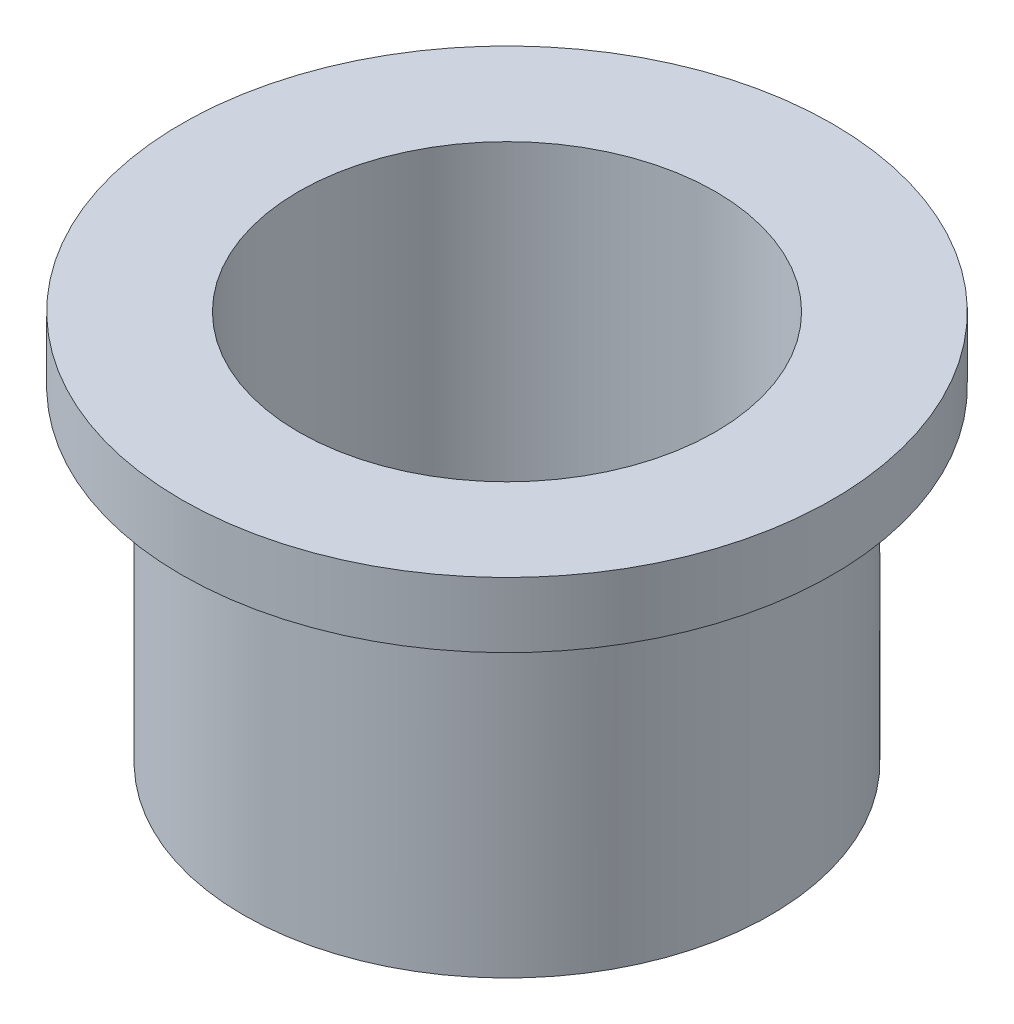
ISO-10303-21;
HEADER;
FILE_DESCRIPTION(('STEP AP214'),'2;1');
FILE_NAME('part.step','',(''),(''),'','','');
FILE_SCHEMA(('AUTOMOTIVE_DESIGN { 1 0 10303 214 1 1 1 1 }'));
ENDSEC;
DATA;
#1=APPLICATION_CONTEXT('core data for automotive mechanical design processes');
#2=APPLICATION_PROTOCOL_DEFINITION('international standard','automotive_design',2000,#1);
#3=PRODUCT_CONTEXT('',#1,'mechanical');
#4=PRODUCT('Part','Part','',(#3));
#5=PRODUCT_RELATED_PRODUCT_CATEGORY('part','',(#4));
#6=PRODUCT_DEFINITION_FORMATION('','',#4);
#7=PRODUCT_DEFINITION_CONTEXT('part definition',#1,'design');
#8=PRODUCT_DEFINITION('design','',#6,#7);
#9=PRODUCT_DEFINITION_SHAPE('','',#8);
#10=(LENGTH_UNIT() NAMED_UNIT(*) SI_UNIT(.MILLI.,.METRE.));
#11=(NAMED_UNIT(*) PLANE_ANGLE_UNIT() SI_UNIT($,.RADIAN.));
#12=(NAMED_UNIT(*) SI_UNIT($,.STERADIAN.) SOLID_ANGLE_UNIT());
#13=UNCERTAINTY_MEASURE_WITH_UNIT(LENGTH_MEASURE(1.E-05),#10,'distance_accuracy_value','');
#14=(GEOMETRIC_REPRESENTATION_CONTEXT(3) GLOBAL_UNCERTAINTY_ASSIGNED_CONTEXT((#13)) GLOBAL_UNIT_ASSIGNED_CONTEXT((#10,
#11,#12)) REPRESENTATION_CONTEXT('',''));
#15=CARTESIAN_POINT('',(0.,0.,0.));
#16=DIRECTION('',(0.,0.,1.));
#17=DIRECTION('',(1.,0.,0.));
#18=AXIS2_PLACEMENT_3D('',#15,#16,#17);
#19=CARTESIAN_POINT('',(0.,2.54,0.));
#20=DIRECTION('',(0.,-1.,0.));
#21=DIRECTION('',(0.,0.,-1.));
#22=AXIS2_PLACEMENT_3D('',#19,#20,#21);
#23=PLANE('',#22);
#24=CARTESIAN_POINT('',(0.,2.54,0.));
#25=DIRECTION('',(0.,-1.,0.));
#26=DIRECTION('',(0.,0.,-1.));
#27=AXIS2_PLACEMENT_3D('',#24,#25,#26);
#28=CIRCLE('',#27,8.128);
#29=CARTESIAN_POINT('',(0.,2.54,-8.128));
#30=VERTEX_POINT('',#29);
#31=EDGE_CURVE('E43',#30,#30,#28,.F.);
#32=ORIENTED_EDGE('',*,*,#31,.F.);
#33=EDGE_LOOP('',(#32));
#34=FACE_BOUND('',#33,.T.);
#35=CARTESIAN_POINT('',(0.,2.53999999999999,0.));
#36=DIRECTION('',(0.,-1.,0.));
#37=DIRECTION('',(0.,0.,-1.));
#38=AXIS2_PLACEMENT_3D('',#35,#36,#37);
#39=CIRCLE('',#38,12.7);
#40=CARTESIAN_POINT('',(0.,2.53999999999999,-12.7));
#41=VERTEX_POINT('',#40);
#42=EDGE_CURVE('E10',#41,#41,#39,.T.);
#43=ORIENTED_EDGE('',*,*,#42,.F.);
#44=EDGE_LOOP('',(#43));
#45=FACE_BOUND('',#44,.T.);
#46=ADVANCED_FACE('F37',(#34,#45),#23,.F.);
#47=CARTESIAN_POINT('',(0.,-12.7,0.));
#48=DIRECTION('',(0.,1.,0.));
#49=DIRECTION('',(0.,0.,1.));
#50=AXIS2_PLACEMENT_3D('',#47,#48,#49);
#51=CYLINDRICAL_SURFACE('',#50,10.287);
#52=CARTESIAN_POINT('',(0.,-12.7,0.));
#53=DIRECTION('',(0.,-1.,0.));
#54=DIRECTION('',(0.,0.,-1.));
#55=AXIS2_PLACEMENT_3D('',#52,#53,#54);
#56=CIRCLE('',#55,10.287);
#57=CARTESIAN_POINT('',(0.,-12.7,-10.287));
#58=VERTEX_POINT('',#57);
#59=EDGE_CURVE('E56',#58,#58,#56,.T.);
#60=ORIENTED_EDGE('',*,*,#59,.F.);
#61=EDGE_LOOP('',(#60));
#62=FACE_BOUND('',#61,.T.);
#63=CARTESIAN_POINT('',(0.,0.,0.));
#64=DIRECTION('',(0.,1.,0.));
#65=DIRECTION('',(0.,0.,1.));
#66=AXIS2_PLACEMENT_3D('',#63,#64,#65);
#67=CIRCLE('',#66,10.287);
#68=CARTESIAN_POINT('',(0.,0.,10.287));
#69=VERTEX_POINT('',#68);
#70=EDGE_CURVE('E47',#69,#69,#67,.F.);
#71=ORIENTED_EDGE('',*,*,#70,.T.);
#72=EDGE_LOOP('',(#71));
#73=FACE_BOUND('',#72,.T.);
#74=ADVANCED_FACE('F67',(#62,#73),#51,.T.);
#75=CARTESIAN_POINT('',(0.,-12.7,0.));
#76=DIRECTION('',(0.,-1.,0.));
#77=DIRECTION('',(0.,0.,-1.));
#78=AXIS2_PLACEMENT_3D('',#75,#76,#77);
#79=PLANE('',#78);
#80=ORIENTED_EDGE('',*,*,#59,.T.);
#81=EDGE_LOOP('',(#80));
#82=FACE_BOUND('',#81,.T.);
#83=CARTESIAN_POINT('',(0.,-12.7,0.));
#84=DIRECTION('',(0.,-1.,0.));
#85=DIRECTION('',(0.,0.,-1.));
#86=AXIS2_PLACEMENT_3D('',#83,#84,#85);
#87=CIRCLE('',#86,8.128);
#88=CARTESIAN_POINT('',(0.,-12.7,-8.128));
#89=VERTEX_POINT('',#88);
#90=EDGE_CURVE('E59',#89,#89,#87,.T.);
#91=ORIENTED_EDGE('',*,*,#90,.F.);
#92=EDGE_LOOP('',(#91));
#93=FACE_BOUND('',#92,.T.);
#94=ADVANCED_FACE('F65',(#82,#93),#79,.T.);
#95=CARTESIAN_POINT('',(0.,0.,0.));
#96=DIRECTION('',(0.,1.,0.));
#97=DIRECTION('',(0.,0.,1.));
#98=AXIS2_PLACEMENT_3D('',#95,#96,#97);
#99=CYLINDRICAL_SURFACE('',#98,8.128);
#100=ORIENTED_EDGE('',*,*,#31,.T.);
#101=EDGE_LOOP('',(#100));
#102=FACE_BOUND('',#101,.T.);
#103=ORIENTED_EDGE('',*,*,#90,.T.);
#104=EDGE_LOOP('',(#103));
#105=FACE_BOUND('',#104,.T.);
#106=ADVANCED_FACE('F63',(#102,#105),#99,.F.);
#107=CARTESIAN_POINT('',(0.,0.,0.));
#108=DIRECTION('',(0.,1.,0.));
#109=DIRECTION('',(0.,0.,1.));
#110=AXIS2_PLACEMENT_3D('',#107,#108,#109);
#111=PLANE('',#110);
#112=CARTESIAN_POINT('',(0.,0.,0.));
#113=DIRECTION('',(0.,1.,0.));
#114=DIRECTION('',(0.,0.,1.));
#115=AXIS2_PLACEMENT_3D('',#112,#113,#114);
#116=CIRCLE('',#115,12.7);
#117=CARTESIAN_POINT('',(0.,0.,12.7));
#118=VERTEX_POINT('',#117);
#119=EDGE_CURVE('E51',#118,#118,#116,.T.);
#120=ORIENTED_EDGE('',*,*,#119,.F.);
#121=EDGE_LOOP('',(#120));
#122=FACE_BOUND('',#121,.T.);
#123=ORIENTED_EDGE('',*,*,#70,.F.);
#124=EDGE_LOOP('',(#123));
#125=FACE_BOUND('',#124,.T.);
#126=ADVANCED_FACE('F76',(#122,#125),#111,.F.);
#127=CARTESIAN_POINT('',(0.,177.8,0.));
#128=DIRECTION('',(0.,-1.,0.));
#129=DIRECTION('',(0.,0.,-1.));
#130=AXIS2_PLACEMENT_3D('',#127,#128,#129);
#131=CYLINDRICAL_SURFACE('',#130,12.7);
#132=ORIENTED_EDGE('',*,*,#42,.T.);
#133=EDGE_LOOP('',(#132));
#134=FACE_BOUND('',#133,.T.);
#135=ORIENTED_EDGE('',*,*,#119,.T.);
#136=EDGE_LOOP('',(#135));
#137=FACE_BOUND('',#136,.T.);
#138=ADVANCED_FACE('F82',(#134,#137),#131,.T.);
#139=CLOSED_SHELL('',(#46,#74,#94,#106,#126,#138));
#140=MANIFOLD_SOLID_BREP('B2',#139);
#141=ADVANCED_BREP_SHAPE_REPRESENTATION('',(#18,#140),#14);
#142=SHAPE_DEFINITION_REPRESENTATION(#9,#141);
ENDSEC;
END-ISO-10303-21;
